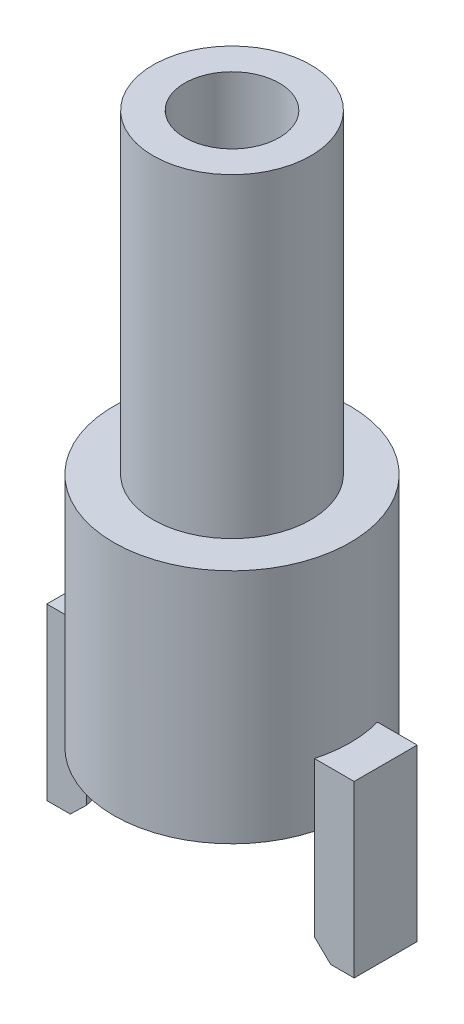
ISO-10303-21;
HEADER;
FILE_DESCRIPTION(('STEP AP214'),'2;1');
FILE_NAME('part.step','',(''),(''),'','','');
FILE_SCHEMA(('AUTOMOTIVE_DESIGN { 1 0 10303 214 1 1 1 1 }'));
ENDSEC;
DATA;
#1=APPLICATION_CONTEXT('core data for automotive mechanical design processes');
#2=APPLICATION_PROTOCOL_DEFINITION('international standard','automotive_design',2000,#1);
#3=PRODUCT_CONTEXT('',#1,'mechanical');
#4=PRODUCT('Part','Part','',(#3));
#5=PRODUCT_RELATED_PRODUCT_CATEGORY('part','',(#4));
#6=PRODUCT_DEFINITION_FORMATION('','',#4);
#7=PRODUCT_DEFINITION_CONTEXT('part definition',#1,'design');
#8=PRODUCT_DEFINITION('design','',#6,#7);
#9=PRODUCT_DEFINITION_SHAPE('','',#8);
#10=(LENGTH_UNIT() NAMED_UNIT(*) SI_UNIT(.MILLI.,.METRE.));
#11=(NAMED_UNIT(*) PLANE_ANGLE_UNIT() SI_UNIT($,.RADIAN.));
#12=(NAMED_UNIT(*) SI_UNIT($,.STERADIAN.) SOLID_ANGLE_UNIT());
#13=UNCERTAINTY_MEASURE_WITH_UNIT(LENGTH_MEASURE(1.E-05),#10,'distance_accuracy_value','');
#14=(GEOMETRIC_REPRESENTATION_CONTEXT(3) GLOBAL_UNCERTAINTY_ASSIGNED_CONTEXT((#13)) GLOBAL_UNIT_ASSIGNED_CONTEXT((#10,
#11,#12)) REPRESENTATION_CONTEXT('',''));
#15=CARTESIAN_POINT('',(0.,0.,0.));
#16=DIRECTION('',(0.,0.,1.));
#17=DIRECTION('',(1.,0.,0.));
#18=AXIS2_PLACEMENT_3D('',#15,#16,#17);
#19=CARTESIAN_POINT('',(0.,-19.05,0.));
#20=DIRECTION('',(0.,1.,0.));
#21=DIRECTION('',(0.,0.,1.));
#22=AXIS2_PLACEMENT_3D('',#19,#20,#21);
#23=CYLINDRICAL_SURFACE('',#22,9.525);
#24=CARTESIAN_POINT('',(0.,0.,0.));
#25=DIRECTION('',(0.,1.,0.));
#26=DIRECTION('',(0.,0.,1.));
#27=AXIS2_PLACEMENT_3D('',#24,#25,#26);
#28=CIRCLE('',#27,9.525);
#29=CARTESIAN_POINT('',(0.,0.,9.525));
#30=VERTEX_POINT('',#29);
#31=EDGE_CURVE('E228',#30,#30,#28,.T.);
#32=ORIENTED_EDGE('',*,*,#31,.F.);
#33=EDGE_LOOP('',(#32));
#34=FACE_BOUND('',#33,.T.);
#35=CARTESIAN_POINT('',(0.,-19.05,0.));
#36=DIRECTION('',(0.,1.,0.));
#37=DIRECTION('',(0.,0.,1.));
#38=AXIS2_PLACEMENT_3D('',#35,#36,#37);
#39=CIRCLE('',#38,9.525);
#40=CARTESIAN_POINT('',(-9.18008850719861,-19.05,2.54));
#41=VERTEX_POINT('',#40);
#42=CARTESIAN_POINT('',(9.18008850719861,-19.05,2.54));
#43=VERTEX_POINT('',#42);
#44=EDGE_CURVE('E233',#41,#43,#39,.T.);
#45=ORIENTED_EDGE('',*,*,#44,.T.);
#46=DIRECTION('',(0.,-1.,0.));
#47=VECTOR('',#46,1.);
#48=CARTESIAN_POINT('',(9.18008850719861,-13.97,2.54));
#49=LINE('',#48,#47);
#50=CARTESIAN_POINT('',(9.18008850719861,-13.97,2.54));
#51=VERTEX_POINT('',#50);
#52=EDGE_CURVE('E187',#51,#43,#49,.T.);
#53=ORIENTED_EDGE('',*,*,#52,.F.);
#54=CARTESIAN_POINT('',(0.,-13.97,0.));
#55=DIRECTION('',(0.,-1.,0.));
#56=DIRECTION('',(0.,0.,-1.));
#57=AXIS2_PLACEMENT_3D('',#54,#55,#56);
#58=CIRCLE('',#57,9.525);
#59=CARTESIAN_POINT('',(9.18008850719861,-13.97,-2.54));
#60=VERTEX_POINT('',#59);
#61=EDGE_CURVE('E178',#60,#51,#58,.T.);
#62=ORIENTED_EDGE('',*,*,#61,.F.);
#63=DIRECTION('',(0.,-1.,0.));
#64=VECTOR('',#63,1.);
#65=CARTESIAN_POINT('',(9.18008850719861,-13.97,-2.54));
#66=LINE('',#65,#64);
#67=CARTESIAN_POINT('',(9.18008850719861,-19.05,-2.54));
#68=VERTEX_POINT('',#67);
#69=EDGE_CURVE('E162',#60,#68,#66,.T.);
#70=ORIENTED_EDGE('',*,*,#69,.T.);
#71=CARTESIAN_POINT('',(-9.18008850719861,-19.05,-2.54));
#72=VERTEX_POINT('',#71);
#73=EDGE_CURVE('E235',#68,#72,#39,.T.);
#74=ORIENTED_EDGE('',*,*,#73,.T.);
#75=DIRECTION('',(0.,-1.,0.));
#76=VECTOR('',#75,1.);
#77=CARTESIAN_POINT('',(-9.18008850719861,-13.97,-2.54));
#78=LINE('',#77,#76);
#79=CARTESIAN_POINT('',(-9.18008850719861,-13.97,-2.54));
#80=VERTEX_POINT('',#79);
#81=EDGE_CURVE('E215',#80,#72,#78,.T.);
#82=ORIENTED_EDGE('',*,*,#81,.F.);
#83=CARTESIAN_POINT('',(0.,-13.97,0.));
#84=DIRECTION('',(0.,-1.,0.));
#85=DIRECTION('',(0.,0.,-1.));
#86=AXIS2_PLACEMENT_3D('',#83,#84,#85);
#87=CIRCLE('',#86,9.525);
#88=CARTESIAN_POINT('',(-9.18008850719861,-13.97,2.54));
#89=VERTEX_POINT('',#88);
#90=EDGE_CURVE('E196',#89,#80,#87,.T.);
#91=ORIENTED_EDGE('',*,*,#90,.F.);
#92=DIRECTION('',(0.,-1.,0.));
#93=VECTOR('',#92,1.);
#94=CARTESIAN_POINT('',(-9.18008850719861,-13.97,2.54));
#95=LINE('',#94,#93);
#96=EDGE_CURVE('E221',#89,#41,#95,.T.);
#97=ORIENTED_EDGE('',*,*,#96,.T.);
#98=EDGE_LOOP('',(#45,#53,#62,#70,#74,#82,#91,#97));
#99=FACE_BOUND('',#98,.T.);
#100=ADVANCED_FACE('F44',(#34,#99),#23,.T.);
#101=CARTESIAN_POINT('',(0.,25.4,0.));
#102=DIRECTION('',(0.,1.,0.));
#103=DIRECTION('',(0.,0.,1.));
#104=AXIS2_PLACEMENT_3D('',#101,#102,#103);
#105=PLANE('',#104);
#106=CARTESIAN_POINT('',(0.,25.4,0.));
#107=DIRECTION('',(0.,1.,0.));
#108=DIRECTION('',(0.,0.,1.));
#109=AXIS2_PLACEMENT_3D('',#106,#107,#108);
#110=CIRCLE('',#109,6.35);
#111=CARTESIAN_POINT('',(0.,25.4,6.35));
#112=VERTEX_POINT('',#111);
#113=EDGE_CURVE('E241',#112,#112,#110,.T.);
#114=ORIENTED_EDGE('',*,*,#113,.T.);
#115=EDGE_LOOP('',(#114));
#116=FACE_BOUND('',#115,.T.);
#117=CARTESIAN_POINT('',(0.,25.4,0.));
#118=DIRECTION('',(0.,1.,0.));
#119=DIRECTION('',(0.,0.,1.));
#120=AXIS2_PLACEMENT_3D('',#117,#118,#119);
#121=CIRCLE('',#120,3.81);
#122=CARTESIAN_POINT('',(0.,25.4,3.81));
#123=VERTEX_POINT('',#122);
#124=EDGE_CURVE('E238',#123,#123,#121,.T.);
#125=ORIENTED_EDGE('',*,*,#124,.F.);
#126=EDGE_LOOP('',(#125));
#127=FACE_BOUND('',#126,.T.);
#128=ADVANCED_FACE('F325',(#116,#127),#105,.T.);
#129=CARTESIAN_POINT('',(0.,25.4,0.));
#130=DIRECTION('',(0.,-1.,0.));
#131=DIRECTION('',(0.,0.,-1.));
#132=AXIS2_PLACEMENT_3D('',#129,#130,#131);
#133=CYLINDRICAL_SURFACE('',#132,6.35);
#134=ORIENTED_EDGE('',*,*,#113,.F.);
#135=EDGE_LOOP('',(#134));
#136=FACE_BOUND('',#135,.T.);
#137=CARTESIAN_POINT('',(0.,0.,0.));
#138=DIRECTION('',(0.,1.,0.));
#139=DIRECTION('',(0.,0.,1.));
#140=AXIS2_PLACEMENT_3D('',#137,#138,#139);
#141=CIRCLE('',#140,6.35);
#142=CARTESIAN_POINT('',(0.,0.,6.35));
#143=VERTEX_POINT('',#142);
#144=EDGE_CURVE('E240',#143,#143,#141,.T.);
#145=ORIENTED_EDGE('',*,*,#144,.T.);
#146=EDGE_LOOP('',(#145));
#147=FACE_BOUND('',#146,.T.);
#148=ADVANCED_FACE('F332',(#136,#147),#133,.T.);
#149=CARTESIAN_POINT('',(0.,25.4,0.));
#150=DIRECTION('',(0.,-1.,0.));
#151=DIRECTION('',(0.,0.,-1.));
#152=AXIS2_PLACEMENT_3D('',#149,#150,#151);
#153=CYLINDRICAL_SURFACE('',#152,3.81);
#154=ORIENTED_EDGE('',*,*,#124,.T.);
#155=EDGE_LOOP('',(#154));
#156=FACE_BOUND('',#155,.T.);
#157=CARTESIAN_POINT('',(0.,0.,0.));
#158=DIRECTION('',(0.,1.,0.));
#159=DIRECTION('',(0.,0.,1.));
#160=AXIS2_PLACEMENT_3D('',#157,#158,#159);
#161=CIRCLE('',#160,3.81);
#162=CARTESIAN_POINT('',(0.,0.,3.81));
#163=VERTEX_POINT('',#162);
#164=EDGE_CURVE('E245',#163,#163,#161,.T.);
#165=ORIENTED_EDGE('',*,*,#164,.F.);
#166=EDGE_LOOP('',(#165));
#167=FACE_BOUND('',#166,.T.);
#168=ADVANCED_FACE('F331',(#156,#167),#153,.F.);
#169=CARTESIAN_POINT('',(0.,0.,0.));
#170=DIRECTION('',(0.,1.,0.));
#171=DIRECTION('',(0.,0.,1.));
#172=AXIS2_PLACEMENT_3D('',#169,#170,#171);
#173=PLANE('',#172);
#174=ORIENTED_EDGE('',*,*,#164,.T.);
#175=EDGE_LOOP('',(#174));
#176=FACE_BOUND('',#175,.T.);
#177=ADVANCED_FACE('F326',(#176),#173,.T.);
#178=ORIENTED_EDGE('',*,*,#144,.F.);
#179=EDGE_LOOP('',(#178));
#180=FACE_BOUND('',#179,.T.);
#181=ORIENTED_EDGE('',*,*,#31,.T.);
#182=EDGE_LOOP('',(#181));
#183=FACE_BOUND('',#182,.T.);
#184=ADVANCED_FACE('F314',(#180,#183),#173,.T.);
#185=CARTESIAN_POINT('',(0.,-19.05,0.));
#186=DIRECTION('',(0.,1.,0.));
#187=DIRECTION('',(0.,0.,1.));
#188=AXIS2_PLACEMENT_3D('',#185,#186,#187);
#189=CYLINDRICAL_SURFACE('',#188,7.62);
#190=CARTESIAN_POINT('',(0.,-19.05,0.));
#191=DIRECTION('',(0.,1.,0.));
#192=DIRECTION('',(0.,0.,1.));
#193=AXIS2_PLACEMENT_3D('',#190,#191,#192);
#194=CIRCLE('',#193,7.62);
#195=CARTESIAN_POINT('',(0.,-19.05,7.62));
#196=VERTEX_POINT('',#195);
#197=EDGE_CURVE('E213',#196,#196,#194,.T.);
#198=CARTESIAN_POINT('',(0.,-2.54,0.));
#199=DIRECTION('',(0.,1.,0.));
#200=DIRECTION('',(0.,0.,1.));
#201=AXIS2_PLACEMENT_3D('',#198,#199,#200);
#202=CIRCLE('',#201,7.62);
#203=CARTESIAN_POINT('',(0.,-2.54,7.62));
#204=VERTEX_POINT('',#203);
#205=EDGE_CURVE('E229',#204,#204,#202,.T.);
#206=CARTESIAN_POINT('',(0.,-19.05,7.62));
#207=CARTESIAN_POINT('',(0.,-18.8780208333333,7.62));
#208=CARTESIAN_POINT('',(0.,-18.7060416666667,7.62));
#209=CARTESIAN_POINT('',(0.,-18.3620833333333,7.62));
#210=CARTESIAN_POINT('',(0.,-18.1901041666667,7.62));
#211=CARTESIAN_POINT('',(0.,-17.8461458333333,7.62));
#212=CARTESIAN_POINT('',(0.,-17.6741666666667,7.62));
#213=CARTESIAN_POINT('',(0.,-17.3302083333333,7.62));
#214=CARTESIAN_POINT('',(0.,-17.1582291666667,7.62));
#215=CARTESIAN_POINT('',(0.,-16.8142708333333,7.62));
#216=CARTESIAN_POINT('',(0.,-16.6422916666667,7.62));
#217=CARTESIAN_POINT('',(0.,-16.2983333333333,7.62));
#218=CARTESIAN_POINT('',(0.,-16.1263541666667,7.62));
#219=CARTESIAN_POINT('',(0.,-15.7823958333333,7.62));
#220=CARTESIAN_POINT('',(0.,-15.6104166666667,7.62));
#221=CARTESIAN_POINT('',(0.,-15.2664583333333,7.62));
#222=CARTESIAN_POINT('',(0.,-15.0944791666667,7.62));
#223=CARTESIAN_POINT('',(0.,-14.7505208333333,7.62));
#224=CARTESIAN_POINT('',(0.,-14.5785416666667,7.62));
#225=CARTESIAN_POINT('',(0.,-14.2345833333333,7.62));
#226=CARTESIAN_POINT('',(0.,-14.0626041666667,7.62));
#227=CARTESIAN_POINT('',(0.,-13.7186458333333,7.62));
#228=CARTESIAN_POINT('',(0.,-13.5466666666667,7.62));
#229=CARTESIAN_POINT('',(0.,-13.2027083333333,7.62));
#230=CARTESIAN_POINT('',(0.,-13.0307291666667,7.62));
#231=CARTESIAN_POINT('',(0.,-12.6867708333333,7.62));
#232=CARTESIAN_POINT('',(0.,-12.5147916666667,7.62));
#233=CARTESIAN_POINT('',(0.,-12.1708333333333,7.62));
#234=CARTESIAN_POINT('',(0.,-11.9988541666667,7.62));
#235=CARTESIAN_POINT('',(0.,-11.6548958333333,7.62));
#236=CARTESIAN_POINT('',(0.,-11.4829166666667,7.62));
#237=CARTESIAN_POINT('',(0.,-11.1389583333333,7.62));
#238=CARTESIAN_POINT('',(0.,-10.9669791666667,7.62));
#239=CARTESIAN_POINT('',(0.,-10.6230208333333,7.62));
#240=CARTESIAN_POINT('',(0.,-10.4510416666667,7.62));
#241=CARTESIAN_POINT('',(0.,-10.1070833333333,7.62));
#242=CARTESIAN_POINT('',(0.,-9.93510416666667,7.62));
#243=CARTESIAN_POINT('',(0.,-9.59114583333333,7.62));
#244=CARTESIAN_POINT('',(0.,-9.41916666666667,7.62));
#245=CARTESIAN_POINT('',(0.,-9.07520833333333,7.62));
#246=CARTESIAN_POINT('',(0.,-8.90322916666667,7.62));
#247=CARTESIAN_POINT('',(0.,-8.55927083333333,7.62));
#248=CARTESIAN_POINT('',(0.,-8.38729166666667,7.62));
#249=CARTESIAN_POINT('',(0.,-8.04333333333333,7.62));
#250=CARTESIAN_POINT('',(0.,-7.87135416666667,7.62));
#251=CARTESIAN_POINT('',(0.,-7.52739583333333,7.62));
#252=CARTESIAN_POINT('',(0.,-7.35541666666667,7.62));
#253=CARTESIAN_POINT('',(0.,-7.01145833333333,7.62));
#254=CARTESIAN_POINT('',(0.,-6.83947916666667,7.62));
#255=CARTESIAN_POINT('',(0.,-6.49552083333333,7.62));
#256=CARTESIAN_POINT('',(0.,-6.32354166666667,7.62));
#257=CARTESIAN_POINT('',(0.,-5.97958333333333,7.62));
#258=CARTESIAN_POINT('',(0.,-5.80760416666666,7.62));
#259=CARTESIAN_POINT('',(0.,-5.46364583333333,7.62));
#260=CARTESIAN_POINT('',(0.,-5.29166666666666,7.62));
#261=CARTESIAN_POINT('',(0.,-4.94770833333333,7.62));
#262=CARTESIAN_POINT('',(0.,-4.77572916666667,7.62));
#263=CARTESIAN_POINT('',(0.,-4.43177083333333,7.62));
#264=CARTESIAN_POINT('',(0.,-4.25979166666666,7.62));
#265=CARTESIAN_POINT('',(0.,-3.91583333333333,7.62));
#266=CARTESIAN_POINT('',(0.,-3.74385416666666,7.62));
#267=CARTESIAN_POINT('',(0.,-3.39989583333333,7.62));
#268=CARTESIAN_POINT('',(0.,-3.22791666666667,7.62));
#269=CARTESIAN_POINT('',(0.,-2.88395833333333,7.62));
#270=CARTESIAN_POINT('',(0.,-2.71197916666667,7.62));
#271=CARTESIAN_POINT('',(0.,-2.54,7.62));
#272=B_SPLINE_CURVE_WITH_KNOTS('',3,(#206,#207,#208,#209,#210,#211,#212,#213,#214,#215,#216,
#217,#218,#219,#220,#221,#222,#223,#224,#225,#226,#227,#228,#229,#230,#231,#232,#233,#234,#235,
#236,#237,#238,#239,#240,#241,#242,#243,#244,#245,#246,#247,#248,#249,#250,#251,#252,#253,#254,
#255,#256,#257,#258,#259,#260,#261,#262,#263,#264,#265,#266,#267,#268,#269,#270,#271),
.UNSPECIFIED.,.F.,.F.,(4,2,2,2,2,2,2,2,2,2,2,2,2,2,2,2,2,2,2,2,2,2,2,2,2,2,2,2,2,2,2,2,4),(0.,
0.515937500000001,1.031875,1.5478125,2.06375,2.5796875,3.095625,3.6115625,4.1275,4.6434375,
5.159375,5.6753125,6.19125,6.7071875,7.223125,7.7390625,8.255,8.7709375,9.286875,9.8028125,
10.31875,10.8346875,11.350625,11.8665625,12.3825,12.8984375,13.414375,13.9303125,14.44625,
14.9621875,15.478125,15.9940625,16.51),.UNSPECIFIED.);
#273=EDGE_CURVE('BSEAM311',#196,#204,#272,.T.);
#274=ORIENTED_EDGE('',*,*,#197,.F.);
#275=ORIENTED_EDGE('',*,*,#205,.T.);
#276=ORIENTED_EDGE('',*,*,#273,.T.);
#277=ORIENTED_EDGE('',*,*,#273,.F.);
#278=EDGE_LOOP('',(#274,#276,#275,#277));
#279=FACE_BOUND('',#278,.T.);
#280=ADVANCED_FACE('F311',(#279),#189,.F.);
#281=CARTESIAN_POINT('',(0.,-19.05,0.));
#282=DIRECTION('',(0.,1.,0.));
#283=DIRECTION('',(0.,0.,1.));
#284=AXIS2_PLACEMENT_3D('',#281,#282,#283);
#285=PLANE('',#284);
#286=ORIENTED_EDGE('',*,*,#197,.T.);
#287=EDGE_LOOP('',(#286));
#288=FACE_BOUND('',#287,.T.);
#289=ORIENTED_EDGE('',*,*,#73,.F.);
#290=CARTESIAN_POINT('',(0.,-19.05,0.));
#291=DIRECTION('',(0.,-1.,0.));
#292=DIRECTION('',(0.,0.,-1.));
#293=AXIS2_PLACEMENT_3D('',#290,#291,#292);
#294=CIRCLE('',#293,9.525);
#295=EDGE_CURVE('E169',#68,#43,#294,.T.);
#296=ORIENTED_EDGE('',*,*,#295,.T.);
#297=ORIENTED_EDGE('',*,*,#44,.F.);
#298=EDGE_CURVE('E227',#72,#41,#39,.T.);
#299=ORIENTED_EDGE('',*,*,#298,.F.);
#300=EDGE_LOOP('',(#289,#296,#297,#299));
#301=FACE_BOUND('',#300,.T.);
#302=ADVANCED_FACE('F313',(#288,#301),#285,.F.);
#303=CARTESIAN_POINT('',(0.,-2.54,0.));
#304=DIRECTION('',(0.,1.,0.));
#305=DIRECTION('',(0.,0.,1.));
#306=AXIS2_PLACEMENT_3D('',#303,#304,#305);
#307=PLANE('',#306);
#308=ORIENTED_EDGE('',*,*,#205,.F.);
#309=EDGE_LOOP('',(#308));
#310=FACE_BOUND('',#309,.T.);
#311=ADVANCED_FACE('F307',(#310),#307,.F.);
#312=CARTESIAN_POINT('',(0.,-13.97,0.));
#313=DIRECTION('',(0.,-1.,0.));
#314=DIRECTION('',(1.,0.,0.));
#315=AXIS2_PLACEMENT_3D('',#312,#313,#314);
#316=CYLINDRICAL_SURFACE('',#315,9.525);
#317=CARTESIAN_POINT('',(-9.18008850719861,-26.416,2.54));
#318=VERTEX_POINT('',#317);
#319=EDGE_CURVE('E212',#41,#318,#95,.T.);
#320=ORIENTED_EDGE('',*,*,#319,.T.);
#321=CARTESIAN_POINT('',(0.,-26.416,0.));
#322=DIRECTION('',(0.,-1.,0.));
#323=DIRECTION('',(1.,0.,0.));
#324=AXIS2_PLACEMENT_3D('',#321,#322,#323);
#325=CIRCLE('',#324,9.525);
#326=CARTESIAN_POINT('',(-9.18008850719861,-26.416,-2.54));
#327=VERTEX_POINT('',#326);
#328=EDGE_CURVE('E283',#318,#327,#325,.T.);
#329=ORIENTED_EDGE('',*,*,#328,.T.);
#330=EDGE_CURVE('E217',#72,#327,#78,.T.);
#331=ORIENTED_EDGE('',*,*,#330,.F.);
#332=ORIENTED_EDGE('',*,*,#298,.T.);
#333=EDGE_LOOP('',(#320,#329,#331,#332));
#334=FACE_BOUND('',#333,.T.);
#335=ADVANCED_FACE('F296',(#334),#316,.F.);
#336=CARTESIAN_POINT('',(0.,-13.97,-2.54));
#337=DIRECTION('',(0.,0.,-1.));
#338=DIRECTION('',(-1.,0.,0.));
#339=AXIS2_PLACEMENT_3D('',#336,#337,#338);
#340=PLANE('',#339);
#341=ORIENTED_EDGE('',*,*,#330,.T.);
#342=CARTESIAN_POINT('',(-9.18008850719861,-26.416,-2.54));
#343=CARTESIAN_POINT('',(-9.28964418681335,-26.521589095401,-2.54));
#344=CARTESIAN_POINT('',(-9.39913325221514,-26.6272472768888,-2.54));
#345=CARTESIAN_POINT('',(-9.61798964830564,-26.8386894079679,-2.54));
#346=CARTESIAN_POINT('',(-9.7273569791276,-26.9444733574213,-2.54));
#347=CARTESIAN_POINT('',(-9.94598161906112,-27.1561548317231,-2.54));
#348=CARTESIAN_POINT('',(-10.0552389281935,-27.2620523565498,-2.54));
#349=CARTESIAN_POINT('',(-10.2736532582812,-27.4739510205917,-2.54));
#350=CARTESIAN_POINT('',(-10.3828102791264,-27.5799521599202,-2.54));
#351=CARTESIAN_POINT('',(-10.49192189258,-27.686,-2.54));
#352=B_SPLINE_CURVE_WITH_KNOTS('',3,(#342,#343,#344,#345,#346,#347,#348,#349,#350,#351),
.UNSPECIFIED.,.F.,.F.,(4,2,2,2,4),(0.,0.456468487983743,0.912936475844703,1.36940437716093,
1.82587277835202),.UNSPECIFIED.);
#353=CARTESIAN_POINT('',(-10.49192189258,-27.686,-2.54));
#354=VERTEX_POINT('',#353);
#355=EDGE_CURVE('E72',#327,#354,#352,.T.);
#356=ORIENTED_EDGE('',*,*,#355,.T.);
#357=DIRECTION('',(1.,0.,0.));
#358=VECTOR('',#357,1.);
#359=CARTESIAN_POINT('',(0.,-27.686,-2.54));
#360=LINE('',#359,#358);
#361=CARTESIAN_POINT('',(-12.3825,-27.686,-2.54));
#362=VERTEX_POINT('',#361);
#363=EDGE_CURVE('E200',#362,#354,#360,.T.);
#364=ORIENTED_EDGE('',*,*,#363,.F.);
#365=DIRECTION('',(0.,-1.,0.));
#366=VECTOR('',#365,1.);
#367=CARTESIAN_POINT('',(-12.3825,-13.97,-2.54));
#368=LINE('',#367,#366);
#369=CARTESIAN_POINT('',(-12.3825,-13.97,-2.54));
#370=VERTEX_POINT('',#369);
#371=EDGE_CURVE('E220',#370,#362,#368,.T.);
#372=ORIENTED_EDGE('',*,*,#371,.F.);
#373=DIRECTION('',(1.,0.,0.));
#374=VECTOR('',#373,1.);
#375=CARTESIAN_POINT('',(0.,-13.97,-2.54));
#376=LINE('',#375,#374);
#377=EDGE_CURVE('E206',#370,#80,#376,.T.);
#378=ORIENTED_EDGE('',*,*,#377,.T.);
#379=ORIENTED_EDGE('',*,*,#81,.T.);
#380=EDGE_LOOP('',(#341,#356,#364,#372,#378,#379));
#381=FACE_BOUND('',#380,.T.);
#382=ADVANCED_FACE('F291',(#381),#340,.T.);
#383=CARTESIAN_POINT('',(-12.3825,-13.97,0.));
#384=DIRECTION('',(-1.,0.,0.));
#385=DIRECTION('',(0.,-1.,0.));
#386=AXIS2_PLACEMENT_3D('',#383,#384,#385);
#387=PLANE('',#386);
#388=DIRECTION('',(0.,0.,-1.));
#389=VECTOR('',#388,1.);
#390=CARTESIAN_POINT('',(-12.3825,-27.686,0.));
#391=LINE('',#390,#389);
#392=CARTESIAN_POINT('',(-12.3825,-27.686,2.54));
#393=VERTEX_POINT('',#392);
#394=EDGE_CURVE('E191',#393,#362,#391,.T.);
#395=ORIENTED_EDGE('',*,*,#394,.F.);
#396=DIRECTION('',(0.,-1.,0.));
#397=VECTOR('',#396,1.);
#398=CARTESIAN_POINT('',(-12.3825,-13.97,2.54));
#399=LINE('',#398,#397);
#400=CARTESIAN_POINT('',(-12.3825,-13.97,2.54));
#401=VERTEX_POINT('',#400);
#402=EDGE_CURVE('E216',#401,#393,#399,.T.);
#403=ORIENTED_EDGE('',*,*,#402,.F.);
#404=DIRECTION('',(0.,0.,-1.));
#405=VECTOR('',#404,1.);
#406=CARTESIAN_POINT('',(-12.3825,-13.97,0.));
#407=LINE('',#406,#405);
#408=EDGE_CURVE('E204',#401,#370,#407,.T.);
#409=ORIENTED_EDGE('',*,*,#408,.T.);
#410=ORIENTED_EDGE('',*,*,#371,.T.);
#411=EDGE_LOOP('',(#395,#403,#409,#410));
#412=FACE_BOUND('',#411,.T.);
#413=ADVANCED_FACE('F300',(#412),#387,.T.);
#414=CARTESIAN_POINT('',(0.,-13.97,2.54));
#415=DIRECTION('',(0.,0.,-1.));
#416=DIRECTION('',(-1.,0.,0.));
#417=AXIS2_PLACEMENT_3D('',#414,#415,#416);
#418=PLANE('',#417);
#419=DIRECTION('',(1.,0.,0.));
#420=VECTOR('',#419,1.);
#421=CARTESIAN_POINT('',(0.,-27.686,2.54));
#422=LINE('',#421,#420);
#423=CARTESIAN_POINT('',(-10.49192189258,-27.686,2.54));
#424=VERTEX_POINT('',#423);
#425=EDGE_CURVE('E186',#393,#424,#422,.T.);
#426=ORIENTED_EDGE('',*,*,#425,.T.);
#427=CARTESIAN_POINT('',(-10.49192189258,-27.686,2.54));
#428=CARTESIAN_POINT('',(-10.3828102791264,-27.5799521599202,2.54));
#429=CARTESIAN_POINT('',(-10.2736532582812,-27.4739510205917,2.54));
#430=CARTESIAN_POINT('',(-10.0552389281935,-27.2620523565498,2.54));
#431=CARTESIAN_POINT('',(-9.94598161906112,-27.1561548317231,2.54));
#432=CARTESIAN_POINT('',(-9.7273569791276,-26.9444733574213,2.54));
#433=CARTESIAN_POINT('',(-9.61798964830564,-26.8386894079679,2.54));
#434=CARTESIAN_POINT('',(-9.39913325221514,-26.6272472768888,2.54));
#435=CARTESIAN_POINT('',(-9.28964418681335,-26.521589095401,2.54));
#436=CARTESIAN_POINT('',(-9.18008850719861,-26.416,2.54));
#437=B_SPLINE_CURVE_WITH_KNOTS('',3,(#427,#428,#429,#430,#431,#432,#433,#434,#435,#436),
.UNSPECIFIED.,.F.,.F.,(4,2,2,2,4),(0.,0.456468401191092,0.91293630250732,1.36940429036828,
1.82587277835202),.UNSPECIFIED.);
#438=EDGE_CURVE('E11',#424,#318,#437,.T.);
#439=ORIENTED_EDGE('',*,*,#438,.T.);
#440=ORIENTED_EDGE('',*,*,#319,.F.);
#441=ORIENTED_EDGE('',*,*,#96,.F.);
#442=DIRECTION('',(1.,0.,0.));
#443=VECTOR('',#442,1.);
#444=CARTESIAN_POINT('',(0.,-13.97,2.54));
#445=LINE('',#444,#443);
#446=EDGE_CURVE('E205',#401,#89,#445,.T.);
#447=ORIENTED_EDGE('',*,*,#446,.F.);
#448=ORIENTED_EDGE('',*,*,#402,.T.);
#449=EDGE_LOOP('',(#426,#439,#440,#441,#447,#448));
#450=FACE_BOUND('',#449,.T.);
#451=ADVANCED_FACE('F301',(#450),#418,.F.);
#452=CARTESIAN_POINT('',(0.,-13.97,0.));
#453=DIRECTION('',(0.,-1.,0.));
#454=DIRECTION('',(0.,0.,-1.));
#455=AXIS2_PLACEMENT_3D('',#452,#453,#454);
#456=PLANE('',#455);
#457=ORIENTED_EDGE('',*,*,#90,.T.);
#458=ORIENTED_EDGE('',*,*,#377,.F.);
#459=ORIENTED_EDGE('',*,*,#408,.F.);
#460=ORIENTED_EDGE('',*,*,#446,.T.);
#461=EDGE_LOOP('',(#457,#458,#459,#460));
#462=FACE_BOUND('',#461,.T.);
#463=ADVANCED_FACE('F299',(#462),#456,.F.);
#464=CARTESIAN_POINT('',(0.,-27.686,0.));
#465=DIRECTION('',(0.,-1.,0.));
#466=DIRECTION('',(0.,0.,-1.));
#467=AXIS2_PLACEMENT_3D('',#464,#465,#466);
#468=PLANE('',#467);
#469=ORIENTED_EDGE('',*,*,#363,.T.);
#470=CARTESIAN_POINT('',(0.,-27.686,0.));
#471=DIRECTION('',(0.,-1.,0.));
#472=DIRECTION('',(0.,0.,-1.));
#473=AXIS2_PLACEMENT_3D('',#470,#471,#472);
#474=CIRCLE('',#473,10.795);
#475=EDGE_CURVE('E58',#354,#424,#474,.F.);
#476=ORIENTED_EDGE('',*,*,#475,.T.);
#477=ORIENTED_EDGE('',*,*,#425,.F.);
#478=ORIENTED_EDGE('',*,*,#394,.T.);
#479=EDGE_LOOP('',(#469,#476,#477,#478));
#480=FACE_BOUND('',#479,.T.);
#481=ADVANCED_FACE('F267',(#480),#468,.T.);
#482=CARTESIAN_POINT('',(0.,-13.97,2.54));
#483=DIRECTION('',(0.,0.,-1.));
#484=DIRECTION('',(-1.,0.,0.));
#485=AXIS2_PLACEMENT_3D('',#482,#483,#484);
#486=PLANE('',#485);
#487=DIRECTION('',(0.,1.,0.));
#488=VECTOR('',#487,1.);
#489=CARTESIAN_POINT('',(9.18008850719861,-26.67,2.54));
#490=LINE('',#489,#488);
#491=CARTESIAN_POINT('',(9.18008850719861,-26.416,2.54));
#492=VERTEX_POINT('',#491);
#493=EDGE_CURVE('E172',#492,#43,#490,.T.);
#494=ORIENTED_EDGE('',*,*,#493,.F.);
#495=CARTESIAN_POINT('',(9.18008850719861,-26.416,2.54));
#496=CARTESIAN_POINT('',(9.28964418681335,-26.521589095401,2.54));
#497=CARTESIAN_POINT('',(9.39913325221514,-26.6272472768887,2.54));
#498=CARTESIAN_POINT('',(9.61798964830565,-26.8386894079678,2.54));
#499=CARTESIAN_POINT('',(9.72735697912761,-26.9444733574213,2.54));
#500=CARTESIAN_POINT('',(9.94598161906115,-27.1561548317231,2.54));
#501=CARTESIAN_POINT('',(10.0552389281936,-27.2620523565498,2.54));
#502=CARTESIAN_POINT('',(10.2736532582812,-27.4739510205917,2.54));
#503=CARTESIAN_POINT('',(10.3828102791265,-27.5799521599202,2.54));
#504=CARTESIAN_POINT('',(10.4919218925801,-27.686,2.54));
#505=B_SPLINE_CURVE_WITH_KNOTS('',3,(#495,#496,#497,#498,#499,#500,#501,#502,#503,#504),
.UNSPECIFIED.,.F.,.F.,(4,2,2,2,4),(0.,0.456468487983759,0.912936475844741,1.36940437716099,
1.8258727783521),.UNSPECIFIED.);
#506=CARTESIAN_POINT('',(10.4919218925801,-27.686,2.54));
#507=VERTEX_POINT('',#506);
#508=EDGE_CURVE('E255',#492,#507,#505,.T.);
#509=ORIENTED_EDGE('',*,*,#508,.T.);
#510=DIRECTION('',(1.,0.,0.));
#511=VECTOR('',#510,1.);
#512=CARTESIAN_POINT('',(0.,-27.686,2.54));
#513=LINE('',#512,#511);
#514=CARTESIAN_POINT('',(12.3825,-27.686,2.54));
#515=VERTEX_POINT('',#514);
#516=EDGE_CURVE('E170',#507,#515,#513,.T.);
#517=ORIENTED_EDGE('',*,*,#516,.T.);
#518=DIRECTION('',(0.,-1.,0.));
#519=VECTOR('',#518,1.);
#520=CARTESIAN_POINT('',(12.3825,-13.97,2.54));
#521=LINE('',#520,#519);
#522=CARTESIAN_POINT('',(12.3825,-13.97,2.54));
#523=VERTEX_POINT('',#522);
#524=EDGE_CURVE('E163',#523,#515,#521,.T.);
#525=ORIENTED_EDGE('',*,*,#524,.F.);
#526=DIRECTION('',(1.,0.,0.));
#527=VECTOR('',#526,1.);
#528=CARTESIAN_POINT('',(0.,-13.97,2.54));
#529=LINE('',#528,#527);
#530=EDGE_CURVE('E183',#51,#523,#529,.T.);
#531=ORIENTED_EDGE('',*,*,#530,.F.);
#532=ORIENTED_EDGE('',*,*,#52,.T.);
#533=EDGE_LOOP('',(#494,#509,#517,#525,#531,#532));
#534=FACE_BOUND('',#533,.T.);
#535=ADVANCED_FACE('F261',(#534),#486,.F.);
#536=CARTESIAN_POINT('',(12.3825,-13.97,0.));
#537=DIRECTION('',(-1.,0.,0.));
#538=DIRECTION('',(0.,-1.,0.));
#539=AXIS2_PLACEMENT_3D('',#536,#537,#538);
#540=PLANE('',#539);
#541=DIRECTION('',(0.,0.,-1.));
#542=VECTOR('',#541,1.);
#543=CARTESIAN_POINT('',(12.3825,-27.686,0.));
#544=LINE('',#543,#542);
#545=CARTESIAN_POINT('',(12.3825,-27.686,-2.54));
#546=VERTEX_POINT('',#545);
#547=EDGE_CURVE('E147',#515,#546,#544,.T.);
#548=ORIENTED_EDGE('',*,*,#547,.T.);
#549=DIRECTION('',(0.,-1.,0.));
#550=VECTOR('',#549,1.);
#551=CARTESIAN_POINT('',(12.3825,-13.97,-2.54));
#552=LINE('',#551,#550);
#553=CARTESIAN_POINT('',(12.3825,-13.97,-2.54));
#554=VERTEX_POINT('',#553);
#555=EDGE_CURVE('E151',#554,#546,#552,.T.);
#556=ORIENTED_EDGE('',*,*,#555,.F.);
#557=DIRECTION('',(0.,0.,-1.));
#558=VECTOR('',#557,1.);
#559=CARTESIAN_POINT('',(12.3825,-13.97,0.));
#560=LINE('',#559,#558);
#561=EDGE_CURVE('E185',#523,#554,#560,.T.);
#562=ORIENTED_EDGE('',*,*,#561,.F.);
#563=ORIENTED_EDGE('',*,*,#524,.T.);
#564=EDGE_LOOP('',(#548,#556,#562,#563));
#565=FACE_BOUND('',#564,.T.);
#566=ADVANCED_FACE('F164',(#565),#540,.F.);
#567=CARTESIAN_POINT('',(0.,-13.97,-2.54));
#568=DIRECTION('',(0.,0.,-1.));
#569=DIRECTION('',(-1.,0.,0.));
#570=AXIS2_PLACEMENT_3D('',#567,#568,#569);
#571=PLANE('',#570);
#572=DIRECTION('',(1.,0.,0.));
#573=VECTOR('',#572,1.);
#574=CARTESIAN_POINT('',(0.,-27.686,-2.54));
#575=LINE('',#574,#573);
#576=CARTESIAN_POINT('',(10.4919218925801,-27.686,-2.54));
#577=VERTEX_POINT('',#576);
#578=EDGE_CURVE('E142',#577,#546,#575,.T.);
#579=ORIENTED_EDGE('',*,*,#578,.F.);
#580=CARTESIAN_POINT('',(10.4919218925801,-27.686,-2.54));
#581=CARTESIAN_POINT('',(10.3828102791265,-27.5799521599202,-2.54));
#582=CARTESIAN_POINT('',(10.2736532582812,-27.4739510205917,-2.54));
#583=CARTESIAN_POINT('',(10.0552389281936,-27.2620523565498,-2.54));
#584=CARTESIAN_POINT('',(9.94598161906115,-27.1561548317231,-2.54));
#585=CARTESIAN_POINT('',(9.72735697912761,-26.9444733574213,-2.54));
#586=CARTESIAN_POINT('',(9.61798964830565,-26.8386894079678,-2.54));
#587=CARTESIAN_POINT('',(9.39913325221515,-26.6272472768887,-2.54));
#588=CARTESIAN_POINT('',(9.28964418681335,-26.521589095401,-2.54));
#589=CARTESIAN_POINT('',(9.18008850719861,-26.416,-2.54));
#590=B_SPLINE_CURVE_WITH_KNOTS('',3,(#580,#581,#582,#583,#584,#585,#586,#587,#588,#589),
.UNSPECIFIED.,.F.,.F.,(4,2,2,2,4),(0.,0.456468401191107,0.912936302507354,1.36940429036834,
1.8258727783521),.UNSPECIFIED.);
#591=CARTESIAN_POINT('',(9.18008850719861,-26.416,-2.54));
#592=VERTEX_POINT('',#591);
#593=EDGE_CURVE('E276',#577,#592,#590,.T.);
#594=ORIENTED_EDGE('',*,*,#593,.T.);
#595=DIRECTION('',(0.,1.,0.));
#596=VECTOR('',#595,1.);
#597=CARTESIAN_POINT('',(9.18008850719861,-26.67,-2.54));
#598=LINE('',#597,#596);
#599=EDGE_CURVE('E176',#592,#68,#598,.T.);
#600=ORIENTED_EDGE('',*,*,#599,.T.);
#601=ORIENTED_EDGE('',*,*,#69,.F.);
#602=DIRECTION('',(1.,0.,0.));
#603=VECTOR('',#602,1.);
#604=CARTESIAN_POINT('',(0.,-13.97,-2.54));
#605=LINE('',#604,#603);
#606=EDGE_CURVE('E158',#60,#554,#605,.T.);
#607=ORIENTED_EDGE('',*,*,#606,.T.);
#608=ORIENTED_EDGE('',*,*,#555,.T.);
#609=EDGE_LOOP('',(#579,#594,#600,#601,#607,#608));
#610=FACE_BOUND('',#609,.T.);
#611=ADVANCED_FACE('F153',(#610),#571,.T.);
#612=CARTESIAN_POINT('',(0.,-13.97,0.));
#613=DIRECTION('',(0.,-1.,0.));
#614=DIRECTION('',(0.,0.,-1.));
#615=AXIS2_PLACEMENT_3D('',#612,#613,#614);
#616=PLANE('',#615);
#617=ORIENTED_EDGE('',*,*,#61,.T.);
#618=ORIENTED_EDGE('',*,*,#530,.T.);
#619=ORIENTED_EDGE('',*,*,#561,.T.);
#620=ORIENTED_EDGE('',*,*,#606,.F.);
#621=EDGE_LOOP('',(#617,#618,#619,#620));
#622=FACE_BOUND('',#621,.T.);
#623=ADVANCED_FACE('F272',(#622),#616,.F.);
#624=CARTESIAN_POINT('',(0.,-26.67,0.));
#625=DIRECTION('',(0.,1.,0.));
#626=DIRECTION('',(-1.,0.,0.));
#627=AXIS2_PLACEMENT_3D('',#624,#625,#626);
#628=CYLINDRICAL_SURFACE('',#627,9.525);
#629=ORIENTED_EDGE('',*,*,#599,.F.);
#630=CARTESIAN_POINT('',(0.,-26.416,0.));
#631=DIRECTION('',(0.,-1.,0.));
#632=DIRECTION('',(1.,0.,0.));
#633=AXIS2_PLACEMENT_3D('',#630,#631,#632);
#634=CIRCLE('',#633,9.525);
#635=EDGE_CURVE('E250',#592,#492,#634,.T.);
#636=ORIENTED_EDGE('',*,*,#635,.T.);
#637=ORIENTED_EDGE('',*,*,#493,.T.);
#638=ORIENTED_EDGE('',*,*,#295,.F.);
#639=EDGE_LOOP('',(#629,#636,#637,#638));
#640=FACE_BOUND('',#639,.T.);
#641=ADVANCED_FACE('F379',(#640),#628,.F.);
#642=CARTESIAN_POINT('',(0.,-27.686,0.));
#643=DIRECTION('',(0.,-1.,0.));
#644=DIRECTION('',(0.,0.,-1.));
#645=AXIS2_PLACEMENT_3D('',#642,#643,#644);
#646=PLANE('',#645);
#647=ORIENTED_EDGE('',*,*,#516,.F.);
#648=CARTESIAN_POINT('',(0.,-27.686,0.));
#649=DIRECTION('',(0.,-1.,0.));
#650=DIRECTION('',(0.,0.,-1.));
#651=AXIS2_PLACEMENT_3D('',#648,#649,#650);
#652=CIRCLE('',#651,10.795);
#653=EDGE_CURVE('E149',#507,#577,#652,.F.);
#654=ORIENTED_EDGE('',*,*,#653,.T.);
#655=ORIENTED_EDGE('',*,*,#578,.T.);
#656=ORIENTED_EDGE('',*,*,#547,.F.);
#657=EDGE_LOOP('',(#647,#654,#655,#656));
#658=FACE_BOUND('',#657,.T.);
#659=ADVANCED_FACE('F144',(#658),#646,.T.);
#660=CARTESIAN_POINT('',(0.,-26.416,0.));
#661=DIRECTION('',(0.,-1.,0.));
#662=DIRECTION('',(1.,0.,0.));
#663=AXIS2_PLACEMENT_3D('',#660,#661,#662);
#664=CONICAL_SURFACE('',#663,9.525,0.785398163397449);
#665=ORIENTED_EDGE('',*,*,#593,.F.);
#666=ORIENTED_EDGE('',*,*,#653,.F.);
#667=ORIENTED_EDGE('',*,*,#508,.F.);
#668=ORIENTED_EDGE('',*,*,#635,.F.);
#669=EDGE_LOOP('',(#665,#666,#667,#668));
#670=FACE_BOUND('',#669,.T.);
#671=ADVANCED_FACE('F262',(#670),#664,.F.);
#672=CARTESIAN_POINT('',(0.,-26.416,0.));
#673=DIRECTION('',(0.,-1.,0.));
#674=DIRECTION('',(1.,0.,0.));
#675=AXIS2_PLACEMENT_3D('',#672,#673,#674);
#676=CONICAL_SURFACE('',#675,9.525,0.78539816339745);
#677=ORIENTED_EDGE('',*,*,#438,.F.);
#678=ORIENTED_EDGE('',*,*,#475,.F.);
#679=ORIENTED_EDGE('',*,*,#355,.F.);
#680=ORIENTED_EDGE('',*,*,#328,.F.);
#681=EDGE_LOOP('',(#677,#678,#679,#680));
#682=FACE_BOUND('',#681,.T.);
#683=ADVANCED_FACE('F48',(#682),#676,.F.);
#684=CLOSED_SHELL('',(#100,#128,#148,#168,#177,#184,#280,#302,#311,#335,#382,#413,#451,#463,
#481,#535,#566,#611,#623,#641,#659,#671,#683));
#685=MANIFOLD_SOLID_BREP('B2',#684);
#686=ADVANCED_BREP_SHAPE_REPRESENTATION('',(#18,#685),#14);
#687=SHAPE_DEFINITION_REPRESENTATION(#9,#686);
ENDSEC;
END-ISO-10303-21;
